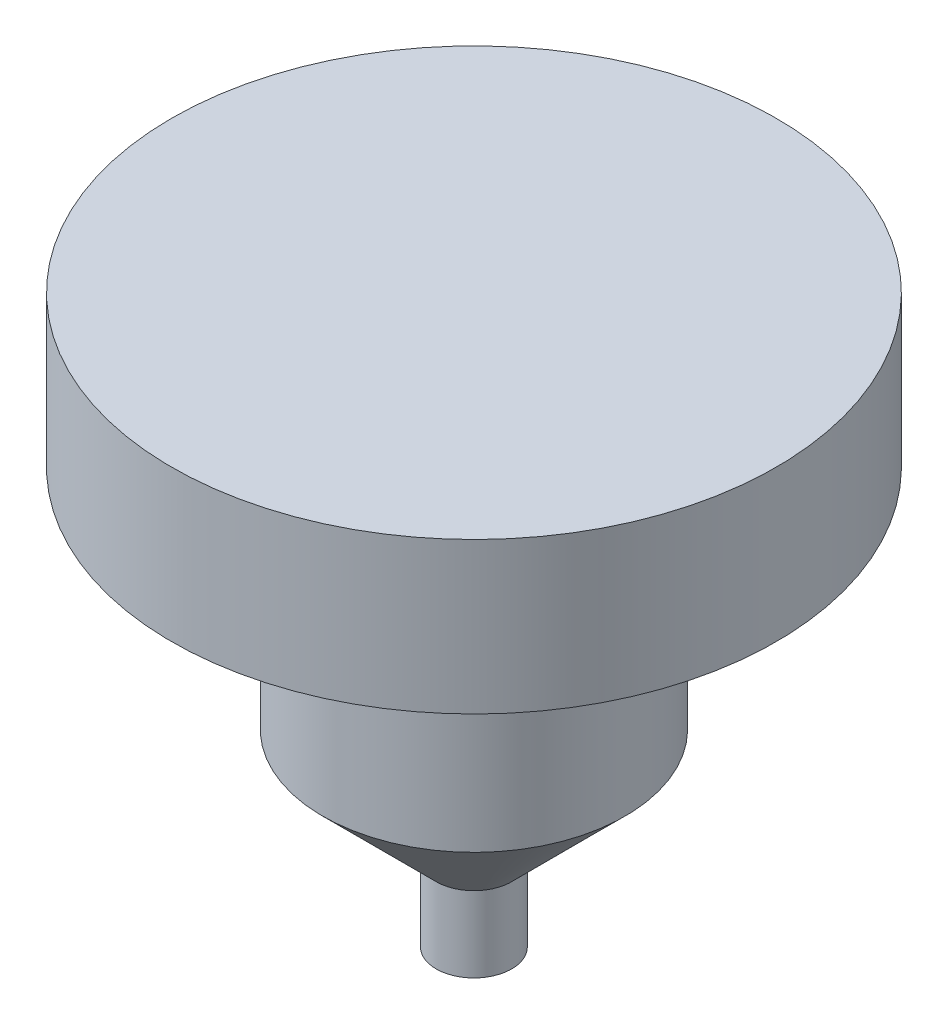
ISO-10303-21;
HEADER;
FILE_DESCRIPTION(('STEP AP214'),'2;1');
FILE_NAME('part.step','',(''),(''),'','','');
FILE_SCHEMA(('AUTOMOTIVE_DESIGN { 1 0 10303 214 1 1 1 1 }'));
ENDSEC;
DATA;
#1=APPLICATION_CONTEXT('core data for automotive mechanical design processes');
#2=APPLICATION_PROTOCOL_DEFINITION('international standard','automotive_design',2000,#1);
#3=PRODUCT_CONTEXT('',#1,'mechanical');
#4=PRODUCT('Part','Part','',(#3));
#5=PRODUCT_RELATED_PRODUCT_CATEGORY('part','',(#4));
#6=PRODUCT_DEFINITION_FORMATION('','',#4);
#7=PRODUCT_DEFINITION_CONTEXT('part definition',#1,'design');
#8=PRODUCT_DEFINITION('design','',#6,#7);
#9=PRODUCT_DEFINITION_SHAPE('','',#8);
#10=(LENGTH_UNIT() NAMED_UNIT(*) SI_UNIT(.MILLI.,.METRE.));
#11=(NAMED_UNIT(*) PLANE_ANGLE_UNIT() SI_UNIT($,.RADIAN.));
#12=(NAMED_UNIT(*) SI_UNIT($,.STERADIAN.) SOLID_ANGLE_UNIT());
#13=UNCERTAINTY_MEASURE_WITH_UNIT(LENGTH_MEASURE(1.E-05),#10,'distance_accuracy_value','');
#14=(GEOMETRIC_REPRESENTATION_CONTEXT(3) GLOBAL_UNCERTAINTY_ASSIGNED_CONTEXT((#13)) GLOBAL_UNIT_ASSIGNED_CONTEXT((#10,
#11,#12)) REPRESENTATION_CONTEXT('',''));
#15=CARTESIAN_POINT('',(0.,0.,0.));
#16=DIRECTION('',(0.,0.,1.));
#17=DIRECTION('',(1.,0.,0.));
#18=AXIS2_PLACEMENT_3D('',#15,#16,#17);
#19=CARTESIAN_POINT('',(20.,57.3094010767587,0.));
#20=DIRECTION('',(0.,1.,0.));
#21=DIRECTION('',(-1.,0.,0.));
#22=AXIS2_PLACEMENT_3D('',#19,#20,#21);
#23=PLANE('',#22);
#24=CARTESIAN_POINT('',(0.,57.3094010767587,0.));
#25=DIRECTION('',(0.,1.,0.));
#26=DIRECTION('',(-1.,0.,0.));
#27=AXIS2_PLACEMENT_3D('',#24,#25,#26);
#28=CIRCLE('',#27,40.);
#29=CARTESIAN_POINT('',(-40.,57.3094010767587,0.));
#30=VERTEX_POINT('',#29);
#31=EDGE_CURVE('E10',#30,#30,#28,.T.);
#32=ORIENTED_EDGE('',*,*,#31,.F.);
#33=EDGE_LOOP('',(#32));
#34=FACE_BOUND('',#33,.T.);
#35=CARTESIAN_POINT('',(0.,57.3094010767587,0.));
#36=DIRECTION('',(0.,1.,0.));
#37=DIRECTION('',(-1.,0.,0.));
#38=AXIS2_PLACEMENT_3D('',#35,#36,#37);
#39=CIRCLE('',#38,20.);
#40=CARTESIAN_POINT('',(-20.,57.3094010767587,0.));
#41=VERTEX_POINT('',#40);
#42=EDGE_CURVE('E55',#41,#41,#39,.T.);
#43=ORIENTED_EDGE('',*,*,#42,.T.);
#44=EDGE_LOOP('',(#43));
#45=FACE_BOUND('',#44,.T.);
#46=ADVANCED_FACE('F30',(#34,#45),#23,.F.);
#47=CARTESIAN_POINT('',(0.,77.3094010767587,0.));
#48=DIRECTION('',(0.,1.,0.));
#49=DIRECTION('',(-1.,0.,0.));
#50=AXIS2_PLACEMENT_3D('',#47,#48,#49);
#51=CYLINDRICAL_SURFACE('',#50,40.);
#52=CARTESIAN_POINT('',(0.,77.3094010767587,0.));
#53=DIRECTION('',(0.,1.,0.));
#54=DIRECTION('',(-1.,0.,0.));
#55=AXIS2_PLACEMENT_3D('',#52,#53,#54);
#56=CIRCLE('',#55,40.);
#57=CARTESIAN_POINT('',(-40.,77.3094010767587,0.));
#58=VERTEX_POINT('',#57);
#59=EDGE_CURVE('E36',#58,#58,#56,.T.);
#60=ORIENTED_EDGE('',*,*,#59,.F.);
#61=EDGE_LOOP('',(#60));
#62=FACE_BOUND('',#61,.T.);
#63=ORIENTED_EDGE('',*,*,#31,.T.);
#64=EDGE_LOOP('',(#63));
#65=FACE_BOUND('',#64,.T.);
#66=ADVANCED_FACE('F91',(#62,#65),#51,.T.);
#67=CARTESIAN_POINT('',(40.,77.3094010767587,0.));
#68=DIRECTION('',(0.,-1.,0.));
#69=DIRECTION('',(1.,0.,0.));
#70=AXIS2_PLACEMENT_3D('',#67,#68,#69);
#71=PLANE('',#70);
#72=ORIENTED_EDGE('',*,*,#59,.T.);
#73=EDGE_LOOP('',(#72));
#74=FACE_BOUND('',#73,.T.);
#75=ADVANCED_FACE('F86',(#74),#71,.F.);
#76=CARTESIAN_POINT('',(0.,0.,0.));
#77=DIRECTION('',(0.,1.,0.));
#78=DIRECTION('',(-1.,0.,0.));
#79=AXIS2_PLACEMENT_3D('',#76,#77,#78);
#80=PLANE('',#79);
#81=CARTESIAN_POINT('',(0.,0.,0.));
#82=DIRECTION('',(0.,1.,0.));
#83=DIRECTION('',(-1.,0.,0.));
#84=AXIS2_PLACEMENT_3D('',#81,#82,#83);
#85=CIRCLE('',#84,1.);
#86=CARTESIAN_POINT('',(-1.,0.,0.));
#87=VERTEX_POINT('',#86);
#88=EDGE_CURVE('E40',#87,#87,#85,.T.);
#89=ORIENTED_EDGE('',*,*,#88,.F.);
#90=EDGE_LOOP('',(#89));
#91=FACE_BOUND('',#90,.T.);
#92=ADVANCED_FACE('F81',(#91),#80,.F.);
#93=CARTESIAN_POINT('',(0.,0.,0.));
#94=DIRECTION('',(0.,1.,0.));
#95=DIRECTION('',(-1.,0.,0.));
#96=AXIS2_PLACEMENT_3D('',#93,#94,#95);
#97=CONICAL_SURFACE('',#96,1.,1.04719755119659);
#98=CARTESIAN_POINT('',(0.,2.30940107675853,0.));
#99=DIRECTION('',(0.,1.,0.));
#100=DIRECTION('',(-1.,0.,0.));
#101=AXIS2_PLACEMENT_3D('',#98,#99,#100);
#102=CIRCLE('',#101,5.00000000000001);
#103=CARTESIAN_POINT('',(-5.00000000000001,2.30940107675853,0.));
#104=VERTEX_POINT('',#103);
#105=EDGE_CURVE('E44',#104,#104,#102,.T.);
#106=CARTESIAN_POINT('',(-5.00000000000001,2.30940107675853,0.));
#107=CARTESIAN_POINT('',(-4.95833333333334,2.2853448155423,0.));
#108=CARTESIAN_POINT('',(-4.91666666666667,2.26128855432606,0.));
#109=CARTESIAN_POINT('',(-4.83333333333334,2.21317603189359,0.));
#110=CARTESIAN_POINT('',(-4.79166666666667,2.18911977067736,0.));
#111=CARTESIAN_POINT('',(-4.70833333333334,2.14100724824489,0.));
#112=CARTESIAN_POINT('',(-4.66666666666667,2.11695098702865,0.));
#113=CARTESIAN_POINT('',(-4.58333333333334,2.06883846459619,0.));
#114=CARTESIAN_POINT('',(-4.54166666666667,2.04478220337995,0.));
#115=CARTESIAN_POINT('',(-4.45833333333334,1.99666968094748,0.));
#116=CARTESIAN_POINT('',(-4.41666666666667,1.97261341973125,0.));
#117=CARTESIAN_POINT('',(-4.33333333333334,1.92450089729878,0.));
#118=CARTESIAN_POINT('',(-4.29166666666667,1.90044463608254,0.));
#119=CARTESIAN_POINT('',(-4.20833333333334,1.85233211365007,0.));
#120=CARTESIAN_POINT('',(-4.16666666666667,1.82827585243384,0.));
#121=CARTESIAN_POINT('',(-4.08333333333334,1.78016333000137,0.));
#122=CARTESIAN_POINT('',(-4.04166666666667,1.75610706878513,0.));
#123=CARTESIAN_POINT('',(-3.95833333333334,1.70799454635266,0.));
#124=CARTESIAN_POINT('',(-3.91666666666667,1.68393828513643,0.));
#125=CARTESIAN_POINT('',(-3.83333333333334,1.63582576270396,0.));
#126=CARTESIAN_POINT('',(-3.79166666666667,1.61176950148773,0.));
#127=CARTESIAN_POINT('',(-3.70833333333334,1.56365697905526,0.));
#128=CARTESIAN_POINT('',(-3.66666666666667,1.53960071783902,0.));
#129=CARTESIAN_POINT('',(-3.58333333333334,1.49148819540655,0.));
#130=CARTESIAN_POINT('',(-3.54166666666667,1.46743193419032,0.));
#131=CARTESIAN_POINT('',(-3.45833333333334,1.41931941175785,0.));
#132=CARTESIAN_POINT('',(-3.41666666666667,1.39526315054161,0.));
#133=CARTESIAN_POINT('',(-3.33333333333334,1.34715062810914,0.));
#134=CARTESIAN_POINT('',(-3.29166666666667,1.32309436689291,0.));
#135=CARTESIAN_POINT('',(-3.20833333333334,1.27498184446044,0.));
#136=CARTESIAN_POINT('',(-3.16666666666667,1.25092558324421,0.));
#137=CARTESIAN_POINT('',(-3.08333333333334,1.20281306081174,0.));
#138=CARTESIAN_POINT('',(-3.04166666666667,1.1787567995955,0.));
#139=CARTESIAN_POINT('',(-2.95833333333334,1.13064427716303,0.));
#140=CARTESIAN_POINT('',(-2.91666666666667,1.1065880159468,0.));
#141=CARTESIAN_POINT('',(-2.83333333333334,1.05847549351433,0.));
#142=CARTESIAN_POINT('',(-2.79166666666667,1.03441923229809,0.));
#143=CARTESIAN_POINT('',(-2.70833333333334,0.986306709865624,0.));
#144=CARTESIAN_POINT('',(-2.66666666666667,0.962250448649389,0.));
#145=CARTESIAN_POINT('',(-2.58333333333334,0.914137926216919,0.));
#146=CARTESIAN_POINT('',(-2.54166666666667,0.890081665000685,0.));
#147=CARTESIAN_POINT('',(-2.45833333333334,0.841969142568215,0.));
#148=CARTESIAN_POINT('',(-2.41666666666667,0.81791288135198,0.));
#149=CARTESIAN_POINT('',(-2.33333333333334,0.769800358919511,0.));
#150=CARTESIAN_POINT('',(-2.29166666666667,0.745744097703276,0.));
#151=CARTESIAN_POINT('',(-2.20833333333334,0.697631575270807,0.));
#152=CARTESIAN_POINT('',(-2.16666666666667,0.673575314054572,0.));
#153=CARTESIAN_POINT('',(-2.08333333333334,0.625462791622103,0.));
#154=CARTESIAN_POINT('',(-2.04166666666667,0.601406530405868,0.));
#155=CARTESIAN_POINT('',(-1.95833333333334,0.553294007973399,0.));
#156=CARTESIAN_POINT('',(-1.91666666666667,0.529237746757164,0.));
#157=CARTESIAN_POINT('',(-1.83333333333334,0.481125224324694,0.));
#158=CARTESIAN_POINT('',(-1.79166666666667,0.45706896310846,0.));
#159=CARTESIAN_POINT('',(-1.70833333333333,0.40895644067599,0.));
#160=CARTESIAN_POINT('',(-1.66666666666667,0.384900179459756,0.));
#161=CARTESIAN_POINT('',(-1.58333333333333,0.336787657027286,0.));
#162=CARTESIAN_POINT('',(-1.54166666666667,0.312731395811051,0.));
#163=CARTESIAN_POINT('',(-1.45833333333333,0.264618873378582,0.));
#164=CARTESIAN_POINT('',(-1.41666666666667,0.240562612162347,0.));
#165=CARTESIAN_POINT('',(-1.33333333333333,0.192450089729878,0.));
#166=CARTESIAN_POINT('',(-1.29166666666667,0.168393828513643,0.));
#167=CARTESIAN_POINT('',(-1.20833333333333,0.120281306081174,0.));
#168=CARTESIAN_POINT('',(-1.16666666666667,0.0962250448649389,0.));
#169=CARTESIAN_POINT('',(-1.08333333333333,0.0481125224324695,0.));
#170=CARTESIAN_POINT('',(-1.04166666666667,0.0240562612162348,0.));
#171=CARTESIAN_POINT('',(-1.,0.,0.));
#172=B_SPLINE_CURVE_WITH_KNOTS('',3,(#106,#107,#108,#109,#110,#111,#112,#113,#114,#115,#116,
#117,#118,#119,#120,#121,#122,#123,#124,#125,#126,#127,#128,#129,#130,#131,#132,#133,#134,#135,
#136,#137,#138,#139,#140,#141,#142,#143,#144,#145,#146,#147,#148,#149,#150,#151,#152,#153,#154,
#155,#156,#157,#158,#159,#160,#161,#162,#163,#164,#165,#166,#167,#168,#169,#170,#171),
.UNSPECIFIED.,.F.,.F.,(4,2,2,2,2,2,2,2,2,2,2,2,2,2,2,2,2,2,2,2,2,2,2,2,2,2,2,2,2,2,2,2,4),(0.,
0.144337567297407,0.288675134594814,0.433012701892222,0.577350269189629,0.721687836487036,
0.866025403784443,1.01036297108185,1.15470053837926,1.29903810567666,1.44337567297407,
1.58771324027148,1.73205080756889,1.87638837486629,2.0207259421637,2.16506350946111,
2.30940107675851,2.45373864405592,2.59807621135333,2.74241377865074,2.88675134594814,
3.03108891324555,3.17542648054296,3.31976404784036,3.46410161513777,3.60843918243518,
3.75277674973259,3.89711431702999,4.0414518843274,4.18578945162481,4.33012701892222,
4.47446458621962,4.61880215351703),.UNSPECIFIED.);
#173=EDGE_CURVE('BSEAM75',#104,#87,#172,.T.);
#174=ORIENTED_EDGE('',*,*,#105,.F.);
#175=ORIENTED_EDGE('',*,*,#88,.T.);
#176=ORIENTED_EDGE('',*,*,#173,.T.);
#177=ORIENTED_EDGE('',*,*,#173,.F.);
#178=EDGE_LOOP('',(#174,#176,#175,#177));
#179=FACE_BOUND('',#178,.T.);
#180=ADVANCED_FACE('F75',(#179),#97,.T.);
#181=CARTESIAN_POINT('',(0.,77.3094010767587,0.));
#182=DIRECTION('',(0.,1.,0.));
#183=DIRECTION('',(-1.,0.,0.));
#184=AXIS2_PLACEMENT_3D('',#181,#182,#183);
#185=CYLINDRICAL_SURFACE('',#184,5.00000000000001);
#186=CARTESIAN_POINT('',(0.,12.3094010767585,0.));
#187=DIRECTION('',(0.,1.,0.));
#188=DIRECTION('',(-1.,0.,0.));
#189=AXIS2_PLACEMENT_3D('',#186,#187,#188);
#190=CIRCLE('',#189,5.00000000000001);
#191=CARTESIAN_POINT('',(-5.00000000000001,12.3094010767585,0.));
#192=VERTEX_POINT('',#191);
#193=EDGE_CURVE('E49',#192,#192,#190,.T.);
#194=ORIENTED_EDGE('',*,*,#193,.F.);
#195=EDGE_LOOP('',(#194));
#196=FACE_BOUND('',#195,.T.);
#197=ORIENTED_EDGE('',*,*,#105,.T.);
#198=EDGE_LOOP('',(#197));
#199=FACE_BOUND('',#198,.T.);
#200=ADVANCED_FACE('F69',(#196,#199),#185,.T.);
#201=CARTESIAN_POINT('',(0.,12.3094010767585,0.));
#202=DIRECTION('',(0.,1.,0.));
#203=DIRECTION('',(-1.,0.,0.));
#204=AXIS2_PLACEMENT_3D('',#201,#202,#203);
#205=CONICAL_SURFACE('',#204,5.00000000000001,0.785398163397443);
#206=CARTESIAN_POINT('',(0.,27.3094010767587,0.));
#207=DIRECTION('',(0.,1.,0.));
#208=DIRECTION('',(-1.,0.,0.));
#209=AXIS2_PLACEMENT_3D('',#206,#207,#208);
#210=CIRCLE('',#209,20.);
#211=CARTESIAN_POINT('',(-20.,27.3094010767587,0.));
#212=VERTEX_POINT('',#211);
#213=EDGE_CURVE('E52',#212,#212,#210,.T.);
#214=CARTESIAN_POINT('',(-20.,27.3094010767587,0.));
#215=CARTESIAN_POINT('',(-19.84375,27.1531510767587,0.));
#216=CARTESIAN_POINT('',(-19.6875,26.9969010767587,0.));
#217=CARTESIAN_POINT('',(-19.375,26.6844010767587,0.));
#218=CARTESIAN_POINT('',(-19.21875,26.5281510767587,0.));
#219=CARTESIAN_POINT('',(-18.90625,26.2156510767587,0.));
#220=CARTESIAN_POINT('',(-18.75,26.0594010767587,0.));
#221=CARTESIAN_POINT('',(-18.4375,25.7469010767587,0.));
#222=CARTESIAN_POINT('',(-18.28125,25.5906510767587,0.));
#223=CARTESIAN_POINT('',(-17.96875,25.2781510767587,0.));
#224=CARTESIAN_POINT('',(-17.8125,25.1219010767587,0.));
#225=CARTESIAN_POINT('',(-17.5,24.8094010767587,0.));
#226=CARTESIAN_POINT('',(-17.34375,24.6531510767587,0.));
#227=CARTESIAN_POINT('',(-17.03125,24.3406510767587,0.));
#228=CARTESIAN_POINT('',(-16.875,24.1844010767587,0.));
#229=CARTESIAN_POINT('',(-16.5625,23.8719010767587,0.));
#230=CARTESIAN_POINT('',(-16.40625,23.7156510767587,0.));
#231=CARTESIAN_POINT('',(-16.09375,23.4031510767587,0.));
#232=CARTESIAN_POINT('',(-15.9375,23.2469010767587,0.));
#233=CARTESIAN_POINT('',(-15.625,22.9344010767587,0.));
#234=CARTESIAN_POINT('',(-15.46875,22.7781510767587,0.));
#235=CARTESIAN_POINT('',(-15.15625,22.4656510767587,0.));
#236=CARTESIAN_POINT('',(-15.,22.3094010767587,0.));
#237=CARTESIAN_POINT('',(-14.6875,21.9969010767587,0.));
#238=CARTESIAN_POINT('',(-14.53125,21.8406510767586,0.));
#239=CARTESIAN_POINT('',(-14.21875,21.5281510767586,0.));
#240=CARTESIAN_POINT('',(-14.0625,21.3719010767586,0.));
#241=CARTESIAN_POINT('',(-13.75,21.0594010767586,0.));
#242=CARTESIAN_POINT('',(-13.59375,20.9031510767586,0.));
#243=CARTESIAN_POINT('',(-13.28125,20.5906510767586,0.));
#244=CARTESIAN_POINT('',(-13.125,20.4344010767586,0.));
#245=CARTESIAN_POINT('',(-12.8125,20.1219010767586,0.));
#246=CARTESIAN_POINT('',(-12.65625,19.9656510767586,0.));
#247=CARTESIAN_POINT('',(-12.34375,19.6531510767586,0.));
#248=CARTESIAN_POINT('',(-12.1875,19.4969010767586,0.));
#249=CARTESIAN_POINT('',(-11.875,19.1844010767586,0.));
#250=CARTESIAN_POINT('',(-11.71875,19.0281510767586,0.));
#251=CARTESIAN_POINT('',(-11.40625,18.7156510767586,0.));
#252=CARTESIAN_POINT('',(-11.25,18.5594010767586,0.));
#253=CARTESIAN_POINT('',(-10.9375,18.2469010767586,0.));
#254=CARTESIAN_POINT('',(-10.78125,18.0906510767586,0.));
#255=CARTESIAN_POINT('',(-10.46875,17.7781510767586,0.));
#256=CARTESIAN_POINT('',(-10.3125,17.6219010767586,0.));
#257=CARTESIAN_POINT('',(-10.,17.3094010767586,0.));
#258=CARTESIAN_POINT('',(-9.84375000000001,17.1531510767586,0.));
#259=CARTESIAN_POINT('',(-9.53125000000001,16.8406510767586,0.));
#260=CARTESIAN_POINT('',(-9.37500000000001,16.6844010767586,0.));
#261=CARTESIAN_POINT('',(-9.06250000000001,16.3719010767586,0.));
#262=CARTESIAN_POINT('',(-8.90625000000001,16.2156510767586,0.));
#263=CARTESIAN_POINT('',(-8.59375000000001,15.9031510767586,0.));
#264=CARTESIAN_POINT('',(-8.43750000000001,15.7469010767586,0.));
#265=CARTESIAN_POINT('',(-8.12500000000001,15.4344010767586,0.));
#266=CARTESIAN_POINT('',(-7.96875000000001,15.2781510767586,0.));
#267=CARTESIAN_POINT('',(-7.65625000000001,14.9656510767586,0.));
#268=CARTESIAN_POINT('',(-7.50000000000001,14.8094010767586,0.));
#269=CARTESIAN_POINT('',(-7.18750000000001,14.4969010767586,0.));
#270=CARTESIAN_POINT('',(-7.03125000000001,14.3406510767586,0.));
#271=CARTESIAN_POINT('',(-6.71875000000001,14.0281510767586,0.));
#272=CARTESIAN_POINT('',(-6.56250000000001,13.8719010767586,0.));
#273=CARTESIAN_POINT('',(-6.25000000000001,13.5594010767586,0.));
#274=CARTESIAN_POINT('',(-6.09375000000001,13.4031510767586,0.));
#275=CARTESIAN_POINT('',(-5.78125000000001,13.0906510767586,0.));
#276=CARTESIAN_POINT('',(-5.62500000000001,12.9344010767586,0.));
#277=CARTESIAN_POINT('',(-5.31250000000001,12.6219010767585,0.));
#278=CARTESIAN_POINT('',(-5.15625000000001,12.4656510767585,0.));
#279=CARTESIAN_POINT('',(-5.00000000000001,12.3094010767585,0.));
#280=B_SPLINE_CURVE_WITH_KNOTS('',3,(#214,#215,#216,#217,#218,#219,#220,#221,#222,#223,#224,
#225,#226,#227,#228,#229,#230,#231,#232,#233,#234,#235,#236,#237,#238,#239,#240,#241,#242,#243,
#244,#245,#246,#247,#248,#249,#250,#251,#252,#253,#254,#255,#256,#257,#258,#259,#260,#261,#262,
#263,#264,#265,#266,#267,#268,#269,#270,#271,#272,#273,#274,#275,#276,#277,#278,#279),
.UNSPECIFIED.,.F.,.F.,(4,2,2,2,2,2,2,2,2,2,2,2,2,2,2,2,2,2,2,2,2,2,2,2,2,2,2,2,2,2,2,2,4),(0.,
0.662912607362391,1.32582521472478,1.98873782208718,2.65165042944957,3.31456303681196,
3.97747564417435,4.64038825153674,5.30330085889914,5.96621346626152,6.62912607362392,
7.29203868098631,7.9549512883487,8.61786389571109,9.28077650307348,9.94368911043588,
10.6066017177983,11.2695143251607,11.9324269325231,12.5953395398854,13.2582521472478,
13.9211647546102,14.5840773619726,15.246989969335,15.9099025766974,16.5728151840598,
17.2357277914222,17.8986403987846,18.561553006147,19.2244656135094,19.8873782208717,
20.5502908282341,21.2132034355965),.UNSPECIFIED.);
#281=EDGE_CURVE('BSEAM63',#212,#192,#280,.T.);
#282=ORIENTED_EDGE('',*,*,#213,.F.);
#283=ORIENTED_EDGE('',*,*,#193,.T.);
#284=ORIENTED_EDGE('',*,*,#281,.T.);
#285=ORIENTED_EDGE('',*,*,#281,.F.);
#286=EDGE_LOOP('',(#282,#284,#283,#285));
#287=FACE_BOUND('',#286,.T.);
#288=ADVANCED_FACE('F63',(#287),#205,.T.);
#289=CARTESIAN_POINT('',(0.,77.3094010767587,0.));
#290=DIRECTION('',(0.,1.,0.));
#291=DIRECTION('',(-1.,0.,0.));
#292=AXIS2_PLACEMENT_3D('',#289,#290,#291);
#293=CYLINDRICAL_SURFACE('',#292,20.);
#294=ORIENTED_EDGE('',*,*,#42,.F.);
#295=EDGE_LOOP('',(#294));
#296=FACE_BOUND('',#295,.T.);
#297=ORIENTED_EDGE('',*,*,#213,.T.);
#298=EDGE_LOOP('',(#297));
#299=FACE_BOUND('',#298,.T.);
#300=ADVANCED_FACE('F60',(#296,#299),#293,.T.);
#301=CLOSED_SHELL('',(#46,#66,#75,#92,#180,#200,#288,#300));
#302=MANIFOLD_SOLID_BREP('B2',#301);
#303=ADVANCED_BREP_SHAPE_REPRESENTATION('',(#18,#302),#14);
#304=SHAPE_DEFINITION_REPRESENTATION(#9,#303);
ENDSEC;
END-ISO-10303-21;
